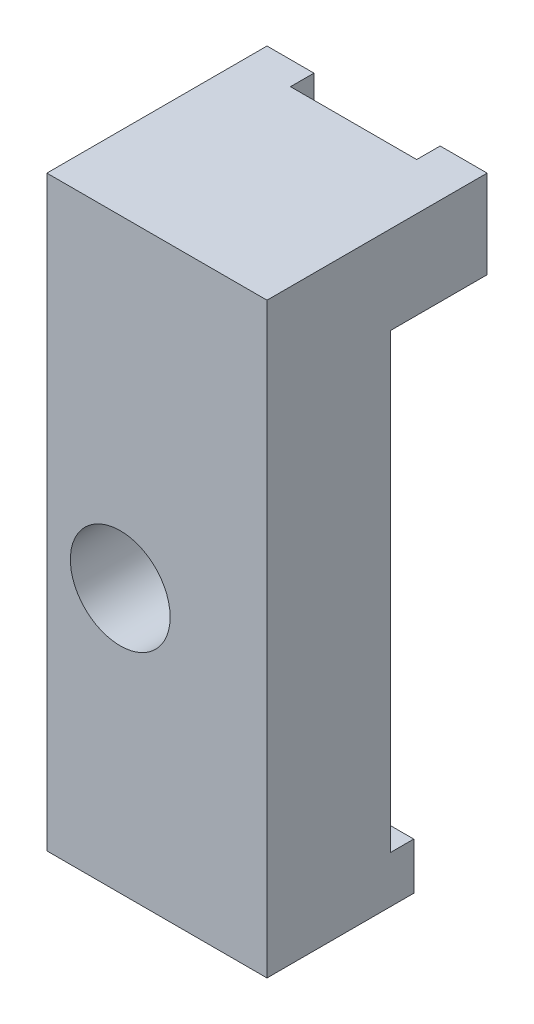
ISO-10303-21;
HEADER;
FILE_DESCRIPTION(('STEP AP214'),'2;1');
FILE_NAME('part.step','',(''),(''),'','','');
FILE_SCHEMA(('AUTOMOTIVE_DESIGN { 1 0 10303 214 1 1 1 1 }'));
ENDSEC;
DATA;
#1=APPLICATION_CONTEXT('core data for automotive mechanical design processes');
#2=APPLICATION_PROTOCOL_DEFINITION('international standard','automotive_design',2000,#1);
#3=PRODUCT_CONTEXT('',#1,'mechanical');
#4=PRODUCT('Part','Part','',(#3));
#5=PRODUCT_RELATED_PRODUCT_CATEGORY('part','',(#4));
#6=PRODUCT_DEFINITION_FORMATION('','',#4);
#7=PRODUCT_DEFINITION_CONTEXT('part definition',#1,'design');
#8=PRODUCT_DEFINITION('design','',#6,#7);
#9=PRODUCT_DEFINITION_SHAPE('','',#8);
#10=(LENGTH_UNIT() NAMED_UNIT(*) SI_UNIT(.MILLI.,.METRE.));
#11=(NAMED_UNIT(*) PLANE_ANGLE_UNIT() SI_UNIT($,.RADIAN.));
#12=(NAMED_UNIT(*) SI_UNIT($,.STERADIAN.) SOLID_ANGLE_UNIT());
#13=UNCERTAINTY_MEASURE_WITH_UNIT(LENGTH_MEASURE(1.E-05),#10,'distance_accuracy_value','');
#14=(GEOMETRIC_REPRESENTATION_CONTEXT(3) GLOBAL_UNCERTAINTY_ASSIGNED_CONTEXT((#13)) GLOBAL_UNIT_ASSIGNED_CONTEXT((#10,
#11,#12)) REPRESENTATION_CONTEXT('',''));
#15=CARTESIAN_POINT('',(0.,0.,0.));
#16=DIRECTION('',(0.,0.,1.));
#17=DIRECTION('',(1.,0.,0.));
#18=AXIS2_PLACEMENT_3D('',#15,#16,#17);
#19=CARTESIAN_POINT('',(0.,0.,-4.7625));
#20=DIRECTION('',(0.,0.,1.));
#21=DIRECTION('',(1.,0.,0.));
#22=AXIS2_PLACEMENT_3D('',#19,#20,#21);
#23=PLANE('',#22);
#24=DIRECTION('',(1.,0.,0.));
#25=VECTOR('',#24,1.);
#26=CARTESIAN_POINT('',(-4.76350000000001,8.89,-4.7625));
#27=LINE('',#26,#25);
#28=CARTESIAN_POINT('',(2.7305,8.89,-4.7625));
#29=VERTEX_POINT('',#28);
#30=CARTESIAN_POINT('',(4.7625,8.89,-4.7625));
#31=VERTEX_POINT('',#30);
#32=EDGE_CURVE('E218',#29,#31,#27,.T.);
#33=ORIENTED_EDGE('',*,*,#32,.F.);
#34=DIRECTION('',(0.,1.,0.));
#35=VECTOR('',#34,1.);
#36=CARTESIAN_POINT('',(2.7305,-12.701,-4.7625));
#37=LINE('',#36,#35);
#38=CARTESIAN_POINT('',(2.7305,12.7,-4.7625));
#39=VERTEX_POINT('',#38);
#40=EDGE_CURVE('E193',#29,#39,#37,.T.);
#41=ORIENTED_EDGE('',*,*,#40,.T.);
#42=DIRECTION('',(-1.,0.,0.));
#43=VECTOR('',#42,1.);
#44=CARTESIAN_POINT('',(-4.7625,12.7,-4.7625));
#45=LINE('',#44,#43);
#46=CARTESIAN_POINT('',(4.7625,12.7,-4.7625));
#47=VERTEX_POINT('',#46);
#48=EDGE_CURVE('E241',#47,#39,#45,.T.);
#49=ORIENTED_EDGE('',*,*,#48,.F.);
#50=DIRECTION('',(0.,1.,0.));
#51=VECTOR('',#50,1.);
#52=CARTESIAN_POINT('',(4.7625,12.7,-4.7625));
#53=LINE('',#52,#51);
#54=EDGE_CURVE('E136',#31,#47,#53,.T.);
#55=ORIENTED_EDGE('',*,*,#54,.F.);
#56=EDGE_LOOP('',(#33,#41,#49,#55));
#57=FACE_BOUND('',#56,.T.);
#58=ADVANCED_FACE('F36',(#57),#23,.F.);
#59=CARTESIAN_POINT('',(4.7625,12.7,4.7625));
#60=DIRECTION('',(-1.,0.,0.));
#61=DIRECTION('',(0.,-1.,0.));
#62=AXIS2_PLACEMENT_3D('',#59,#60,#61);
#63=PLANE('',#62);
#64=DIRECTION('',(0.,-1.,0.));
#65=VECTOR('',#64,1.);
#66=CARTESIAN_POINT('',(4.7625,-12.7,-1.5875));
#67=LINE('',#66,#65);
#68=CARTESIAN_POINT('',(4.7625,-10.668,-1.5875));
#69=VERTEX_POINT('',#68);
#70=CARTESIAN_POINT('',(4.7625,-12.7,-1.5875));
#71=VERTEX_POINT('',#70);
#72=EDGE_CURVE('E215',#69,#71,#67,.T.);
#73=ORIENTED_EDGE('',*,*,#72,.F.);
#74=DIRECTION('',(0.,0.,-1.));
#75=VECTOR('',#74,1.);
#76=CARTESIAN_POINT('',(4.7625,-10.668,-1.5875));
#77=LINE('',#76,#75);
#78=CARTESIAN_POINT('',(4.7625,-10.668,-0.5715));
#79=VERTEX_POINT('',#78);
#80=EDGE_CURVE('E155',#79,#69,#77,.T.);
#81=ORIENTED_EDGE('',*,*,#80,.F.);
#82=DIRECTION('',(0.,-1.,0.));
#83=VECTOR('',#82,1.);
#84=CARTESIAN_POINT('',(4.7625,-10.668,-0.5715));
#85=LINE('',#84,#83);
#86=CARTESIAN_POINT('',(4.7625,8.89,-0.5715));
#87=VERTEX_POINT('',#86);
#88=EDGE_CURVE('E162',#87,#79,#85,.T.);
#89=ORIENTED_EDGE('',*,*,#88,.F.);
#90=DIRECTION('',(0.,0.,1.));
#91=VECTOR('',#90,1.);
#92=CARTESIAN_POINT('',(4.7625,8.89,-4.7625));
#93=LINE('',#92,#91);
#94=EDGE_CURVE('E143',#31,#87,#93,.T.);
#95=ORIENTED_EDGE('',*,*,#94,.F.);
#96=ORIENTED_EDGE('',*,*,#54,.T.);
#97=DIRECTION('',(0.,0.,-1.));
#98=VECTOR('',#97,1.);
#99=CARTESIAN_POINT('',(4.7625,12.7,4.7625));
#100=LINE('',#99,#98);
#101=CARTESIAN_POINT('',(4.7625,12.7,4.7625));
#102=VERTEX_POINT('',#101);
#103=EDGE_CURVE('E11',#102,#47,#100,.T.);
#104=ORIENTED_EDGE('',*,*,#103,.F.);
#105=DIRECTION('',(0.,1.,0.));
#106=VECTOR('',#105,1.);
#107=CARTESIAN_POINT('',(4.7625,12.7,4.7625));
#108=LINE('',#107,#106);
#109=CARTESIAN_POINT('',(4.7625,-12.7,4.7625));
#110=VERTEX_POINT('',#109);
#111=EDGE_CURVE('E225',#110,#102,#108,.T.);
#112=ORIENTED_EDGE('',*,*,#111,.F.);
#113=DIRECTION('',(0.,0.,-1.));
#114=VECTOR('',#113,1.);
#115=CARTESIAN_POINT('',(4.7625,-12.7,4.7625));
#116=LINE('',#115,#114);
#117=EDGE_CURVE('E237',#110,#71,#116,.T.);
#118=ORIENTED_EDGE('',*,*,#117,.T.);
#119=EDGE_LOOP('',(#73,#81,#89,#95,#96,#104,#112,#118));
#120=FACE_BOUND('',#119,.T.);
#121=ADVANCED_FACE('F38',(#120),#63,.F.);
#122=CARTESIAN_POINT('',(-4.7625,12.7,4.7625));
#123=DIRECTION('',(0.,-1.,0.));
#124=DIRECTION('',(0.,0.,-1.));
#125=AXIS2_PLACEMENT_3D('',#122,#123,#124);
#126=PLANE('',#125);
#127=ORIENTED_EDGE('',*,*,#48,.T.);
#128=DIRECTION('',(0.,0.,-1.));
#129=VECTOR('',#128,1.);
#130=CARTESIAN_POINT('',(2.7305,12.7,-4.7625));
#131=LINE('',#130,#129);
#132=CARTESIAN_POINT('',(2.7305,12.7,-3.7465));
#133=VERTEX_POINT('',#132);
#134=EDGE_CURVE('E182',#133,#39,#131,.T.);
#135=ORIENTED_EDGE('',*,*,#134,.F.);
#136=DIRECTION('',(1.,0.,0.));
#137=VECTOR('',#136,1.);
#138=CARTESIAN_POINT('',(2.7305,12.7,-3.7465));
#139=LINE('',#138,#137);
#140=CARTESIAN_POINT('',(-2.7305,12.7,-3.7465));
#141=VERTEX_POINT('',#140);
#142=EDGE_CURVE('E189',#141,#133,#139,.T.);
#143=ORIENTED_EDGE('',*,*,#142,.F.);
#144=DIRECTION('',(0.,0.,1.));
#145=VECTOR('',#144,1.);
#146=CARTESIAN_POINT('',(-2.7305,12.7,-4.7625));
#147=LINE('',#146,#145);
#148=CARTESIAN_POINT('',(-2.7305,12.7,-4.7625));
#149=VERTEX_POINT('',#148);
#150=EDGE_CURVE('E185',#149,#141,#147,.T.);
#151=ORIENTED_EDGE('',*,*,#150,.F.);
#152=CARTESIAN_POINT('',(-4.7625,12.7,-4.7625));
#153=VERTEX_POINT('',#152);
#154=EDGE_CURVE('E240',#149,#153,#45,.T.);
#155=ORIENTED_EDGE('',*,*,#154,.T.);
#156=DIRECTION('',(0.,0.,-1.));
#157=VECTOR('',#156,1.);
#158=CARTESIAN_POINT('',(-4.7625,12.7,4.7625));
#159=LINE('',#158,#157);
#160=CARTESIAN_POINT('',(-4.7625,12.7,4.7625));
#161=VERTEX_POINT('',#160);
#162=EDGE_CURVE('E46',#161,#153,#159,.T.);
#163=ORIENTED_EDGE('',*,*,#162,.F.);
#164=DIRECTION('',(-1.,0.,0.));
#165=VECTOR('',#164,1.);
#166=CARTESIAN_POINT('',(-4.7625,12.7,4.7625));
#167=LINE('',#166,#165);
#168=EDGE_CURVE('E228',#102,#161,#167,.T.);
#169=ORIENTED_EDGE('',*,*,#168,.F.);
#170=ORIENTED_EDGE('',*,*,#103,.T.);
#171=EDGE_LOOP('',(#127,#135,#143,#151,#155,#163,#169,#170));
#172=FACE_BOUND('',#171,.T.);
#173=ADVANCED_FACE('F271',(#172),#126,.F.);
#174=CARTESIAN_POINT('',(-4.7625,12.7,4.7625));
#175=DIRECTION('',(1.,0.,0.));
#176=DIRECTION('',(0.,1.,0.));
#177=AXIS2_PLACEMENT_3D('',#174,#175,#176);
#178=PLANE('',#177);
#179=DIRECTION('',(0.,-1.,0.));
#180=VECTOR('',#179,1.);
#181=CARTESIAN_POINT('',(-4.7625,-10.668,-0.5715));
#182=LINE('',#181,#180);
#183=CARTESIAN_POINT('',(-4.76250000000001,8.89,-0.5715));
#184=VERTEX_POINT('',#183);
#185=CARTESIAN_POINT('',(-4.7625,-10.668,-0.5715));
#186=VERTEX_POINT('',#185);
#187=EDGE_CURVE('E131',#184,#186,#182,.T.);
#188=ORIENTED_EDGE('',*,*,#187,.T.);
#189=DIRECTION('',(0.,0.,-1.));
#190=VECTOR('',#189,1.);
#191=CARTESIAN_POINT('',(-4.7625,-10.668,-1.5875));
#192=LINE('',#191,#190);
#193=CARTESIAN_POINT('',(-4.7625,-10.668,-1.5875));
#194=VERTEX_POINT('',#193);
#195=EDGE_CURVE('E149',#186,#194,#192,.T.);
#196=ORIENTED_EDGE('',*,*,#195,.T.);
#197=DIRECTION('',(0.,1.,0.));
#198=VECTOR('',#197,1.);
#199=CARTESIAN_POINT('',(-4.7625,-12.7,-1.5875));
#200=LINE('',#199,#198);
#201=CARTESIAN_POINT('',(-4.7625,-12.7,-1.5875));
#202=VERTEX_POINT('',#201);
#203=EDGE_CURVE('E210',#202,#194,#200,.T.);
#204=ORIENTED_EDGE('',*,*,#203,.F.);
#205=DIRECTION('',(0.,0.,-1.));
#206=VECTOR('',#205,1.);
#207=CARTESIAN_POINT('',(-4.7625,-12.7,4.7625));
#208=LINE('',#207,#206);
#209=CARTESIAN_POINT('',(-4.7625,-12.7,4.7625));
#210=VERTEX_POINT('',#209);
#211=EDGE_CURVE('E250',#210,#202,#208,.T.);
#212=ORIENTED_EDGE('',*,*,#211,.F.);
#213=DIRECTION('',(0.,-1.,0.));
#214=VECTOR('',#213,1.);
#215=CARTESIAN_POINT('',(-4.7625,12.7,4.7625));
#216=LINE('',#215,#214);
#217=EDGE_CURVE('E231',#161,#210,#216,.T.);
#218=ORIENTED_EDGE('',*,*,#217,.F.);
#219=ORIENTED_EDGE('',*,*,#162,.T.);
#220=DIRECTION('',(0.,-1.,0.));
#221=VECTOR('',#220,1.);
#222=CARTESIAN_POINT('',(-4.7625,12.7,-4.7625));
#223=LINE('',#222,#221);
#224=CARTESIAN_POINT('',(-4.7625,8.89,-4.7625));
#225=VERTEX_POINT('',#224);
#226=EDGE_CURVE('E134',#153,#225,#223,.T.);
#227=ORIENTED_EDGE('',*,*,#226,.T.);
#228=DIRECTION('',(0.,0.,-1.));
#229=VECTOR('',#228,1.);
#230=CARTESIAN_POINT('',(-4.7625,8.89,-4.7625));
#231=LINE('',#230,#229);
#232=EDGE_CURVE('E61',#184,#225,#231,.T.);
#233=ORIENTED_EDGE('',*,*,#232,.F.);
#234=EDGE_LOOP('',(#188,#196,#204,#212,#218,#219,#227,#233));
#235=FACE_BOUND('',#234,.T.);
#236=ADVANCED_FACE('F128',(#235),#178,.F.);
#237=CARTESIAN_POINT('',(-4.7625,-12.7,4.7625));
#238=DIRECTION('',(0.,1.,0.));
#239=DIRECTION('',(0.,0.,1.));
#240=AXIS2_PLACEMENT_3D('',#237,#238,#239);
#241=PLANE('',#240);
#242=ORIENTED_EDGE('',*,*,#211,.T.);
#243=DIRECTION('',(1.,0.,0.));
#244=VECTOR('',#243,1.);
#245=CARTESIAN_POINT('',(-4.7635,-12.7,-1.5875));
#246=LINE('',#245,#244);
#247=EDGE_CURVE('E137',#202,#71,#246,.T.);
#248=ORIENTED_EDGE('',*,*,#247,.T.);
#249=ORIENTED_EDGE('',*,*,#117,.F.);
#250=DIRECTION('',(1.,0.,0.));
#251=VECTOR('',#250,1.);
#252=CARTESIAN_POINT('',(-4.7625,-12.7,4.7625));
#253=LINE('',#252,#251);
#254=EDGE_CURVE('E234',#210,#110,#253,.T.);
#255=ORIENTED_EDGE('',*,*,#254,.F.);
#256=EDGE_LOOP('',(#242,#248,#249,#255));
#257=FACE_BOUND('',#256,.T.);
#258=ADVANCED_FACE('F290',(#257),#241,.F.);
#259=CARTESIAN_POINT('',(0.,0.,4.7625));
#260=DIRECTION('',(0.,0.,1.));
#261=DIRECTION('',(1.,0.,0.));
#262=AXIS2_PLACEMENT_3D('',#259,#260,#261);
#263=PLANE('',#262);
#264=CARTESIAN_POINT('',(-1.5875,-1.27,4.7625));
#265=DIRECTION('',(0.,0.,1.));
#266=DIRECTION('',(1.,0.,0.));
#267=AXIS2_PLACEMENT_3D('',#264,#265,#266);
#268=CIRCLE('',#267,2.159);
#269=CARTESIAN_POINT('',(0.571499999999997,-1.27,4.7625));
#270=VERTEX_POINT('',#269);
#271=EDGE_CURVE('E197',#270,#270,#268,.T.);
#272=ORIENTED_EDGE('',*,*,#271,.F.);
#273=EDGE_LOOP('',(#272));
#274=FACE_BOUND('',#273,.T.);
#275=ORIENTED_EDGE('',*,*,#111,.T.);
#276=ORIENTED_EDGE('',*,*,#168,.T.);
#277=ORIENTED_EDGE('',*,*,#217,.T.);
#278=ORIENTED_EDGE('',*,*,#254,.T.);
#279=EDGE_LOOP('',(#275,#276,#277,#278));
#280=FACE_BOUND('',#279,.T.);
#281=ADVANCED_FACE('F294',(#274,#280),#263,.T.);
#282=ORIENTED_EDGE('',*,*,#154,.F.);
#283=DIRECTION('',(0.,1.,0.));
#284=VECTOR('',#283,1.);
#285=CARTESIAN_POINT('',(-2.7305,-12.701,-4.7625));
#286=LINE('',#285,#284);
#287=CARTESIAN_POINT('',(-2.7305,8.88999999999999,-4.7625));
#288=VERTEX_POINT('',#287);
#289=EDGE_CURVE('E201',#288,#149,#286,.T.);
#290=ORIENTED_EDGE('',*,*,#289,.F.);
#291=EDGE_CURVE('E222',#225,#288,#27,.T.);
#292=ORIENTED_EDGE('',*,*,#291,.F.);
#293=ORIENTED_EDGE('',*,*,#226,.F.);
#294=EDGE_LOOP('',(#282,#290,#292,#293));
#295=FACE_BOUND('',#294,.T.);
#296=ADVANCED_FACE('F261',(#295),#23,.F.);
#297=CARTESIAN_POINT('',(-4.7635,-12.7,-1.5875));
#298=DIRECTION('',(0.,0.,1.));
#299=DIRECTION('',(1.,0.,0.));
#300=AXIS2_PLACEMENT_3D('',#297,#298,#299);
#301=PLANE('',#300);
#302=ORIENTED_EDGE('',*,*,#203,.T.);
#303=DIRECTION('',(1.,0.,0.));
#304=VECTOR('',#303,1.);
#305=CARTESIAN_POINT('',(-4.7625,-10.668,-1.5875));
#306=LINE('',#305,#304);
#307=EDGE_CURVE('E167',#194,#69,#306,.T.);
#308=ORIENTED_EDGE('',*,*,#307,.T.);
#309=ORIENTED_EDGE('',*,*,#72,.T.);
#310=ORIENTED_EDGE('',*,*,#247,.F.);
#311=EDGE_LOOP('',(#302,#308,#309,#310));
#312=FACE_BOUND('',#311,.T.);
#313=ADVANCED_FACE('F286',(#312),#301,.F.);
#314=CARTESIAN_POINT('',(-4.76350000000001,8.89,-4.7625));
#315=DIRECTION('',(0.,1.,0.));
#316=DIRECTION('',(0.,0.,1.));
#317=AXIS2_PLACEMENT_3D('',#314,#315,#316);
#318=PLANE('',#317);
#319=DIRECTION('',(-1.,0.,0.));
#320=VECTOR('',#319,1.);
#321=CARTESIAN_POINT('',(2.73049999999999,8.89,-3.7465));
#322=LINE('',#321,#320);
#323=CARTESIAN_POINT('',(2.7305,8.88999999999999,-3.7465));
#324=VERTEX_POINT('',#323);
#325=CARTESIAN_POINT('',(-2.7305,8.89,-3.7465));
#326=VERTEX_POINT('',#325);
#327=EDGE_CURVE('E53',#324,#326,#322,.T.);
#328=ORIENTED_EDGE('',*,*,#327,.F.);
#329=DIRECTION('',(0.,0.,1.));
#330=VECTOR('',#329,1.);
#331=CARTESIAN_POINT('',(2.7305,8.89,-4.76249999999999));
#332=LINE('',#331,#330);
#333=EDGE_CURVE('E178',#29,#324,#332,.T.);
#334=ORIENTED_EDGE('',*,*,#333,.F.);
#335=ORIENTED_EDGE('',*,*,#32,.T.);
#336=ORIENTED_EDGE('',*,*,#94,.T.);
#337=DIRECTION('',(1.,0.,0.));
#338=VECTOR('',#337,1.);
#339=CARTESIAN_POINT('',(-4.76250000000001,8.89,-0.5715));
#340=LINE('',#339,#338);
#341=EDGE_CURVE('E140',#184,#87,#340,.T.);
#342=ORIENTED_EDGE('',*,*,#341,.F.);
#343=ORIENTED_EDGE('',*,*,#232,.T.);
#344=ORIENTED_EDGE('',*,*,#291,.T.);
#345=DIRECTION('',(0.,0.,-1.));
#346=VECTOR('',#345,1.);
#347=CARTESIAN_POINT('',(-2.7305,8.89,-4.76249999999999));
#348=LINE('',#347,#346);
#349=EDGE_CURVE('E173',#326,#288,#348,.T.);
#350=ORIENTED_EDGE('',*,*,#349,.F.);
#351=EDGE_LOOP('',(#328,#334,#335,#336,#342,#343,#344,#350));
#352=FACE_BOUND('',#351,.T.);
#353=ADVANCED_FACE('F141',(#352),#318,.F.);
#354=CARTESIAN_POINT('',(-1.5875,-1.27,-4.7635));
#355=DIRECTION('',(0.,0.,1.));
#356=DIRECTION('',(1.,0.,0.));
#357=AXIS2_PLACEMENT_3D('',#354,#355,#356);
#358=CYLINDRICAL_SURFACE('',#357,2.159);
#359=CARTESIAN_POINT('',(-1.5875,-1.27,-0.5715));
#360=DIRECTION('',(0.,0.,1.));
#361=DIRECTION('',(1.,0.,0.));
#362=AXIS2_PLACEMENT_3D('',#359,#360,#361);
#363=CIRCLE('',#362,2.159);
#364=CARTESIAN_POINT('',(0.571499999999997,-1.27,-0.5715));
#365=VERTEX_POINT('',#364);
#366=EDGE_CURVE('E40',#365,#365,#363,.F.);
#367=ORIENTED_EDGE('',*,*,#366,.T.);
#368=EDGE_LOOP('',(#367));
#369=FACE_BOUND('',#368,.T.);
#370=ORIENTED_EDGE('',*,*,#271,.T.);
#371=EDGE_LOOP('',(#370));
#372=FACE_BOUND('',#371,.T.);
#373=ADVANCED_FACE('F347',(#369,#372),#358,.F.);
#374=CARTESIAN_POINT('',(2.7305,-12.701,-4.7625));
#375=DIRECTION('',(1.,0.,0.));
#376=DIRECTION('',(0.,0.,-1.));
#377=AXIS2_PLACEMENT_3D('',#374,#375,#376);
#378=PLANE('',#377);
#379=ORIENTED_EDGE('',*,*,#333,.T.);
#380=DIRECTION('',(0.,1.,0.));
#381=VECTOR('',#380,1.);
#382=CARTESIAN_POINT('',(2.7305,-12.701,-3.7465));
#383=LINE('',#382,#381);
#384=EDGE_CURVE('E194',#324,#133,#383,.T.);
#385=ORIENTED_EDGE('',*,*,#384,.T.);
#386=ORIENTED_EDGE('',*,*,#134,.T.);
#387=ORIENTED_EDGE('',*,*,#40,.F.);
#388=EDGE_LOOP('',(#379,#385,#386,#387));
#389=FACE_BOUND('',#388,.T.);
#390=ADVANCED_FACE('F274',(#389),#378,.F.);
#391=CARTESIAN_POINT('',(2.7305,-12.701,-3.7465));
#392=DIRECTION('',(0.,0.,1.));
#393=DIRECTION('',(1.,0.,0.));
#394=AXIS2_PLACEMENT_3D('',#391,#392,#393);
#395=PLANE('',#394);
#396=ORIENTED_EDGE('',*,*,#327,.T.);
#397=DIRECTION('',(0.,1.,0.));
#398=VECTOR('',#397,1.);
#399=CARTESIAN_POINT('',(-2.7305,-12.701,-3.7465));
#400=LINE('',#399,#398);
#401=EDGE_CURVE('E198',#326,#141,#400,.T.);
#402=ORIENTED_EDGE('',*,*,#401,.T.);
#403=ORIENTED_EDGE('',*,*,#142,.T.);
#404=ORIENTED_EDGE('',*,*,#384,.F.);
#405=EDGE_LOOP('',(#396,#402,#403,#404));
#406=FACE_BOUND('',#405,.T.);
#407=ADVANCED_FACE('F269',(#406),#395,.F.);
#408=CARTESIAN_POINT('',(-2.7305,-12.701,-4.7625));
#409=DIRECTION('',(-1.,0.,0.));
#410=DIRECTION('',(0.,0.,1.));
#411=AXIS2_PLACEMENT_3D('',#408,#409,#410);
#412=PLANE('',#411);
#413=ORIENTED_EDGE('',*,*,#349,.T.);
#414=ORIENTED_EDGE('',*,*,#289,.T.);
#415=ORIENTED_EDGE('',*,*,#150,.T.);
#416=ORIENTED_EDGE('',*,*,#401,.F.);
#417=EDGE_LOOP('',(#413,#414,#415,#416));
#418=FACE_BOUND('',#417,.T.);
#419=ADVANCED_FACE('F266',(#418),#412,.F.);
#420=CARTESIAN_POINT('',(-4.7625,-10.668,-0.5715));
#421=DIRECTION('',(0.,0.,1.));
#422=DIRECTION('',(1.,0.,0.));
#423=AXIS2_PLACEMENT_3D('',#420,#421,#422);
#424=PLANE('',#423);
#425=ORIENTED_EDGE('',*,*,#88,.T.);
#426=DIRECTION('',(1.,0.,0.));
#427=VECTOR('',#426,1.);
#428=CARTESIAN_POINT('',(-4.7625,-10.668,-0.5715));
#429=LINE('',#428,#427);
#430=EDGE_CURVE('E148',#186,#79,#429,.T.);
#431=ORIENTED_EDGE('',*,*,#430,.F.);
#432=ORIENTED_EDGE('',*,*,#187,.F.);
#433=ORIENTED_EDGE('',*,*,#341,.T.);
#434=EDGE_LOOP('',(#425,#431,#432,#433));
#435=FACE_BOUND('',#434,.T.);
#436=ORIENTED_EDGE('',*,*,#366,.F.);
#437=EDGE_LOOP('',(#436));
#438=FACE_BOUND('',#437,.T.);
#439=ADVANCED_FACE('F151',(#435,#438),#424,.F.);
#440=CARTESIAN_POINT('',(-4.7625,-10.668,-1.5875));
#441=DIRECTION('',(0.,-1.,0.));
#442=DIRECTION('',(1.,0.,0.));
#443=AXIS2_PLACEMENT_3D('',#440,#441,#442);
#444=PLANE('',#443);
#445=ORIENTED_EDGE('',*,*,#80,.T.);
#446=ORIENTED_EDGE('',*,*,#307,.F.);
#447=ORIENTED_EDGE('',*,*,#195,.F.);
#448=ORIENTED_EDGE('',*,*,#430,.T.);
#449=EDGE_LOOP('',(#445,#446,#447,#448));
#450=FACE_BOUND('',#449,.T.);
#451=ADVANCED_FACE('F284',(#450),#444,.F.);
#452=CLOSED_SHELL('',(#58,#121,#173,#236,#258,#281,#296,#313,#353,#373,#390,#407,#419,#439,#451));
#453=MANIFOLD_SOLID_BREP('B2',#452);
#454=ADVANCED_BREP_SHAPE_REPRESENTATION('',(#18,#453),#14);
#455=SHAPE_DEFINITION_REPRESENTATION(#9,#454);
ENDSEC;
END-ISO-10303-21;
